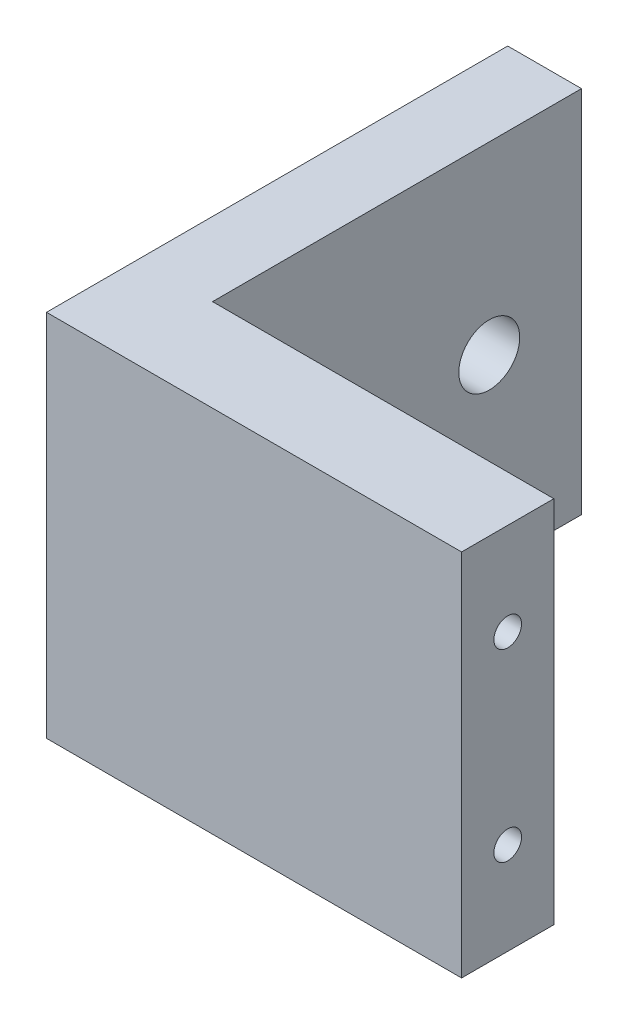
ISO-10303-21;
HEADER;
FILE_DESCRIPTION(('STEP AP214'),'2;1');
FILE_NAME('part.step','',(''),(''),'','','');
FILE_SCHEMA(('AUTOMOTIVE_DESIGN { 1 0 10303 214 1 1 1 1 }'));
ENDSEC;
DATA;
#1=APPLICATION_CONTEXT('core data for automotive mechanical design processes');
#2=APPLICATION_PROTOCOL_DEFINITION('international standard','automotive_design',2000,#1);
#3=PRODUCT_CONTEXT('',#1,'mechanical');
#4=PRODUCT('Part','Part','',(#3));
#5=PRODUCT_RELATED_PRODUCT_CATEGORY('part','',(#4));
#6=PRODUCT_DEFINITION_FORMATION('','',#4);
#7=PRODUCT_DEFINITION_CONTEXT('part definition',#1,'design');
#8=PRODUCT_DEFINITION('design','',#6,#7);
#9=PRODUCT_DEFINITION_SHAPE('','',#8);
#10=(LENGTH_UNIT() NAMED_UNIT(*) SI_UNIT(.MILLI.,.METRE.));
#11=(NAMED_UNIT(*) PLANE_ANGLE_UNIT() SI_UNIT($,.RADIAN.));
#12=(NAMED_UNIT(*) SI_UNIT($,.STERADIAN.) SOLID_ANGLE_UNIT());
#13=UNCERTAINTY_MEASURE_WITH_UNIT(LENGTH_MEASURE(1.E-05),#10,'distance_accuracy_value','');
#14=(GEOMETRIC_REPRESENTATION_CONTEXT(3) GLOBAL_UNCERTAINTY_ASSIGNED_CONTEXT((#13)) GLOBAL_UNIT_ASSIGNED_CONTEXT((#10,
#11,#12)) REPRESENTATION_CONTEXT('',''));
#15=CARTESIAN_POINT('',(0.,0.,0.));
#16=DIRECTION('',(0.,0.,1.));
#17=DIRECTION('',(1.,0.,0.));
#18=AXIS2_PLACEMENT_3D('',#15,#16,#17);
#19=CARTESIAN_POINT('',(0.002299999999991,20.,10.));
#20=DIRECTION('',(1.,0.,0.));
#21=DIRECTION('',(0.,0.,-1.));
#22=AXIS2_PLACEMENT_3D('',#19,#20,#21);
#23=CYLINDRICAL_SURFACE('',#22,3.3);
#24=CARTESIAN_POINT('',(0.002299999999991,20.,10.));
#25=DIRECTION('',(1.,0.,0.));
#26=DIRECTION('',(0.,0.,-1.));
#27=AXIS2_PLACEMENT_3D('',#24,#25,#26);
#28=CIRCLE('',#27,3.3);
#29=CARTESIAN_POINT('',(0.002299999999991,20.,6.7));
#30=VERTEX_POINT('',#29);
#31=EDGE_CURVE('E95',#30,#30,#28,.F.);
#32=ORIENTED_EDGE('',*,*,#31,.T.);
#33=EDGE_LOOP('',(#32));
#34=FACE_BOUND('',#33,.T.);
#35=CARTESIAN_POINT('',(8.0023,20.,10.));
#36=DIRECTION('',(1.,0.,0.));
#37=DIRECTION('',(0.,0.,-1.));
#38=AXIS2_PLACEMENT_3D('',#35,#36,#37);
#39=CIRCLE('',#38,3.3);
#40=CARTESIAN_POINT('',(8.0023,20.,6.7));
#41=VERTEX_POINT('',#40);
#42=EDGE_CURVE('E19',#41,#41,#39,.F.);
#43=ORIENTED_EDGE('',*,*,#42,.F.);
#44=EDGE_LOOP('',(#43));
#45=FACE_BOUND('',#44,.T.);
#46=ADVANCED_FACE('F16',(#34,#45),#23,.F.);
#47=CARTESIAN_POINT('',(0.002299999999991,20.,30.));
#48=DIRECTION('',(1.,0.,0.));
#49=DIRECTION('',(0.,0.,-1.));
#50=AXIS2_PLACEMENT_3D('',#47,#48,#49);
#51=CYLINDRICAL_SURFACE('',#50,3.3);
#52=CARTESIAN_POINT('',(0.002299999999991,20.,30.));
#53=DIRECTION('',(1.,0.,0.));
#54=DIRECTION('',(0.,0.,-1.));
#55=AXIS2_PLACEMENT_3D('',#52,#53,#54);
#56=CIRCLE('',#55,3.3);
#57=CARTESIAN_POINT('',(0.002299999999991,20.,26.7));
#58=VERTEX_POINT('',#57);
#59=EDGE_CURVE('E89',#58,#58,#56,.F.);
#60=ORIENTED_EDGE('',*,*,#59,.T.);
#61=EDGE_LOOP('',(#60));
#62=FACE_BOUND('',#61,.T.);
#63=CARTESIAN_POINT('',(8.0023,20.,30.));
#64=DIRECTION('',(1.,0.,0.));
#65=DIRECTION('',(0.,0.,-1.));
#66=AXIS2_PLACEMENT_3D('',#63,#64,#65);
#67=CIRCLE('',#66,3.3);
#68=CARTESIAN_POINT('',(8.0023,20.,26.7));
#69=VERTEX_POINT('',#68);
#70=EDGE_CURVE('E96',#69,#69,#67,.F.);
#71=ORIENTED_EDGE('',*,*,#70,.F.);
#72=EDGE_LOOP('',(#71));
#73=FACE_BOUND('',#72,.T.);
#74=ADVANCED_FACE('F121',(#62,#73),#51,.F.);
#75=CARTESIAN_POINT('',(37.0023,30.,45.));
#76=DIRECTION('',(-1.,0.,0.));
#77=DIRECTION('',(0.,0.,1.));
#78=AXIS2_PLACEMENT_3D('',#75,#76,#77);
#79=PLANE('',#78);
#80=CARTESIAN_POINT('',(37.0023,30.,45.));
#81=DIRECTION('',(-1.,0.,0.));
#82=DIRECTION('',(0.,0.,1.));
#83=AXIS2_PLACEMENT_3D('',#80,#81,#82);
#84=CIRCLE('',#83,1.5);
#85=CARTESIAN_POINT('',(37.0023,30.,46.5));
#86=VERTEX_POINT('',#85);
#87=EDGE_CURVE('E115',#86,#86,#84,.F.);
#88=ORIENTED_EDGE('',*,*,#87,.T.);
#89=EDGE_LOOP('',(#88));
#90=FACE_BOUND('',#89,.T.);
#91=ADVANCED_FACE('F197',(#90),#79,.F.);
#92=CARTESIAN_POINT('',(37.0023,10.,45.));
#93=DIRECTION('',(-1.,0.,0.));
#94=DIRECTION('',(0.,0.,1.));
#95=AXIS2_PLACEMENT_3D('',#92,#93,#94);
#96=PLANE('',#95);
#97=CARTESIAN_POINT('',(37.0023,10.,45.));
#98=DIRECTION('',(-1.,0.,0.));
#99=DIRECTION('',(0.,0.,1.));
#100=AXIS2_PLACEMENT_3D('',#97,#98,#99);
#101=CIRCLE('',#100,1.5);
#102=CARTESIAN_POINT('',(37.0023,10.,46.5));
#103=VERTEX_POINT('',#102);
#104=EDGE_CURVE('E111',#103,#103,#101,.F.);
#105=ORIENTED_EDGE('',*,*,#104,.T.);
#106=EDGE_LOOP('',(#105));
#107=FACE_BOUND('',#106,.T.);
#108=ADVANCED_FACE('F194',(#107),#96,.F.);
#109=CARTESIAN_POINT('',(0.002299999999991,0.,0.));
#110=DIRECTION('',(0.,0.,1.));
#111=DIRECTION('',(1.,0.,0.));
#112=AXIS2_PLACEMENT_3D('',#109,#110,#111);
#113=PLANE('',#112);
#114=DIRECTION('',(0.,1.,0.));
#115=VECTOR('',#114,1.);
#116=CARTESIAN_POINT('',(8.0023,0.,0.));
#117=LINE('',#116,#115);
#118=CARTESIAN_POINT('',(8.0023,0.,0.));
#119=VERTEX_POINT('',#118);
#120=CARTESIAN_POINT('',(8.0023,40.,0.));
#121=VERTEX_POINT('',#120);
#122=EDGE_CURVE('E66',#119,#121,#117,.T.);
#123=ORIENTED_EDGE('',*,*,#122,.F.);
#124=DIRECTION('',(1.,0.,0.));
#125=VECTOR('',#124,1.);
#126=CARTESIAN_POINT('',(0.002299999999991,0.,0.));
#127=LINE('',#126,#125);
#128=CARTESIAN_POINT('',(0.002299999999991,0.,0.));
#129=VERTEX_POINT('',#128);
#130=EDGE_CURVE('E75',#119,#129,#127,.F.);
#131=ORIENTED_EDGE('',*,*,#130,.T.);
#132=DIRECTION('',(0.,1.,0.));
#133=VECTOR('',#132,1.);
#134=CARTESIAN_POINT('',(0.002299999999991,0.,0.));
#135=LINE('',#134,#133);
#136=CARTESIAN_POINT('',(0.002299999999991,40.,0.));
#137=VERTEX_POINT('',#136);
#138=EDGE_CURVE('E86',#129,#137,#135,.T.);
#139=ORIENTED_EDGE('',*,*,#138,.T.);
#140=DIRECTION('',(1.,0.,0.));
#141=VECTOR('',#140,1.);
#142=CARTESIAN_POINT('',(0.002299999999991,40.,0.));
#143=LINE('',#142,#141);
#144=EDGE_CURVE('E114',#121,#137,#143,.F.);
#145=ORIENTED_EDGE('',*,*,#144,.F.);
#146=EDGE_LOOP('',(#123,#131,#139,#145));
#147=FACE_BOUND('',#146,.T.);
#148=ADVANCED_FACE('F85',(#147),#113,.F.);
#149=CARTESIAN_POINT('',(8.0023,0.,0.));
#150=DIRECTION('',(1.,0.,0.));
#151=DIRECTION('',(0.,0.,-1.));
#152=AXIS2_PLACEMENT_3D('',#149,#150,#151);
#153=PLANE('',#152);
#154=ORIENTED_EDGE('',*,*,#70,.T.);
#155=EDGE_LOOP('',(#154));
#156=FACE_BOUND('',#155,.T.);
#157=ORIENTED_EDGE('',*,*,#42,.T.);
#158=EDGE_LOOP('',(#157));
#159=FACE_BOUND('',#158,.T.);
#160=DIRECTION('',(0.,0.,1.));
#161=VECTOR('',#160,1.);
#162=CARTESIAN_POINT('',(8.0023,40.,0.));
#163=LINE('',#162,#161);
#164=CARTESIAN_POINT('',(8.0023,40.,40.));
#165=VERTEX_POINT('',#164);
#166=EDGE_CURVE('E141',#165,#121,#163,.F.);
#167=ORIENTED_EDGE('',*,*,#166,.F.);
#168=DIRECTION('',(0.,1.,0.));
#169=VECTOR('',#168,1.);
#170=CARTESIAN_POINT('',(8.0023,0.,40.));
#171=LINE('',#170,#169);
#172=CARTESIAN_POINT('',(8.0023,0.,40.));
#173=VERTEX_POINT('',#172);
#174=EDGE_CURVE('E82',#165,#173,#171,.F.);
#175=ORIENTED_EDGE('',*,*,#174,.T.);
#176=DIRECTION('',(0.,0.,1.));
#177=VECTOR('',#176,1.);
#178=CARTESIAN_POINT('',(8.0023,0.,0.));
#179=LINE('',#178,#177);
#180=EDGE_CURVE('E88',#173,#119,#179,.F.);
#181=ORIENTED_EDGE('',*,*,#180,.T.);
#182=ORIENTED_EDGE('',*,*,#122,.T.);
#183=EDGE_LOOP('',(#167,#175,#181,#182));
#184=FACE_BOUND('',#183,.T.);
#185=ADVANCED_FACE('F134',(#156,#159,#184),#153,.T.);
#186=CARTESIAN_POINT('',(45.0023,30.,45.));
#187=DIRECTION('',(-1.,0.,0.));
#188=DIRECTION('',(0.,0.,1.));
#189=AXIS2_PLACEMENT_3D('',#186,#187,#188);
#190=CYLINDRICAL_SURFACE('',#189,1.5);
#191=CARTESIAN_POINT('',(45.0023,30.,45.));
#192=DIRECTION('',(-1.,0.,0.));
#193=DIRECTION('',(0.,0.,1.));
#194=AXIS2_PLACEMENT_3D('',#191,#192,#193);
#195=CIRCLE('',#194,1.5);
#196=CARTESIAN_POINT('',(45.0023,30.,46.5));
#197=VERTEX_POINT('',#196);
#198=EDGE_CURVE('E107',#197,#197,#195,.T.);
#199=ORIENTED_EDGE('',*,*,#198,.F.);
#200=EDGE_LOOP('',(#199));
#201=FACE_BOUND('',#200,.T.);
#202=ORIENTED_EDGE('',*,*,#87,.F.);
#203=EDGE_LOOP('',(#202));
#204=FACE_BOUND('',#203,.T.);
#205=ADVANCED_FACE('F137',(#201,#204),#190,.F.);
#206=CARTESIAN_POINT('',(45.0023,10.,45.));
#207=DIRECTION('',(-1.,0.,0.));
#208=DIRECTION('',(0.,0.,1.));
#209=AXIS2_PLACEMENT_3D('',#206,#207,#208);
#210=CYLINDRICAL_SURFACE('',#209,1.5);
#211=CARTESIAN_POINT('',(45.0023,10.,45.));
#212=DIRECTION('',(-1.,0.,0.));
#213=DIRECTION('',(0.,0.,1.));
#214=AXIS2_PLACEMENT_3D('',#211,#212,#213);
#215=CIRCLE('',#214,1.5);
#216=CARTESIAN_POINT('',(45.0023,10.,46.5));
#217=VERTEX_POINT('',#216);
#218=EDGE_CURVE('E104',#217,#217,#215,.T.);
#219=ORIENTED_EDGE('',*,*,#218,.F.);
#220=EDGE_LOOP('',(#219));
#221=FACE_BOUND('',#220,.T.);
#222=ORIENTED_EDGE('',*,*,#104,.F.);
#223=EDGE_LOOP('',(#222));
#224=FACE_BOUND('',#223,.T.);
#225=ADVANCED_FACE('F185',(#221,#224),#210,.F.);
#226=CARTESIAN_POINT('',(0.002299999999991,0.,40.));
#227=DIRECTION('',(0.,0.,1.));
#228=DIRECTION('',(1.,0.,0.));
#229=AXIS2_PLACEMENT_3D('',#226,#227,#228);
#230=PLANE('',#229);
#231=DIRECTION('',(0.,1.,0.));
#232=VECTOR('',#231,1.);
#233=CARTESIAN_POINT('',(45.0023,0.,40.));
#234=LINE('',#233,#232);
#235=CARTESIAN_POINT('',(45.0023,0.,40.));
#236=VERTEX_POINT('',#235);
#237=CARTESIAN_POINT('',(45.0023,40.,40.));
#238=VERTEX_POINT('',#237);
#239=EDGE_CURVE('E110',#236,#238,#234,.T.);
#240=ORIENTED_EDGE('',*,*,#239,.F.);
#241=DIRECTION('',(1.,0.,0.));
#242=VECTOR('',#241,1.);
#243=CARTESIAN_POINT('',(0.002299999999991,0.,40.));
#244=LINE('',#243,#242);
#245=EDGE_CURVE('E81',#236,#173,#244,.F.);
#246=ORIENTED_EDGE('',*,*,#245,.T.);
#247=ORIENTED_EDGE('',*,*,#174,.F.);
#248=DIRECTION('',(1.,0.,0.));
#249=VECTOR('',#248,1.);
#250=CARTESIAN_POINT('',(0.002299999999991,40.,40.));
#251=LINE('',#250,#249);
#252=EDGE_CURVE('E150',#238,#165,#251,.F.);
#253=ORIENTED_EDGE('',*,*,#252,.F.);
#254=EDGE_LOOP('',(#240,#246,#247,#253));
#255=FACE_BOUND('',#254,.T.);
#256=ADVANCED_FACE('F125',(#255),#230,.F.);
#257=CARTESIAN_POINT('',(0.002299999999991,0.,40.));
#258=DIRECTION('',(1.,0.,0.));
#259=DIRECTION('',(0.,0.,-1.));
#260=AXIS2_PLACEMENT_3D('',#257,#258,#259);
#261=PLANE('',#260);
#262=DIRECTION('',(0.,0.,1.));
#263=VECTOR('',#262,1.);
#264=CARTESIAN_POINT('',(0.002299999999991,40.,40.));
#265=LINE('',#264,#263);
#266=CARTESIAN_POINT('',(0.002299999999991,40.,50.));
#267=VERTEX_POINT('',#266);
#268=EDGE_CURVE('E94',#137,#267,#265,.T.);
#269=ORIENTED_EDGE('',*,*,#268,.F.);
#270=ORIENTED_EDGE('',*,*,#138,.F.);
#271=DIRECTION('',(0.,0.,1.));
#272=VECTOR('',#271,1.);
#273=CARTESIAN_POINT('',(0.002299999999991,0.,40.));
#274=LINE('',#273,#272);
#275=CARTESIAN_POINT('',(0.002299999999991,0.,50.));
#276=VERTEX_POINT('',#275);
#277=EDGE_CURVE('E72',#129,#276,#274,.T.);
#278=ORIENTED_EDGE('',*,*,#277,.T.);
#279=DIRECTION('',(0.,1.,0.));
#280=VECTOR('',#279,1.);
#281=CARTESIAN_POINT('',(0.002299999999991,0.,50.));
#282=LINE('',#281,#280);
#283=EDGE_CURVE('E153',#267,#276,#282,.F.);
#284=ORIENTED_EDGE('',*,*,#283,.F.);
#285=EDGE_LOOP('',(#269,#270,#278,#284));
#286=FACE_BOUND('',#285,.T.);
#287=ORIENTED_EDGE('',*,*,#59,.F.);
#288=EDGE_LOOP('',(#287));
#289=FACE_BOUND('',#288,.T.);
#290=ORIENTED_EDGE('',*,*,#31,.F.);
#291=EDGE_LOOP('',(#290));
#292=FACE_BOUND('',#291,.T.);
#293=ADVANCED_FACE('F91',(#286,#289,#292),#261,.F.);
#294=CARTESIAN_POINT('',(0.002299999999991,0.,40.));
#295=DIRECTION('',(0.,1.,0.));
#296=DIRECTION('',(0.,0.,1.));
#297=AXIS2_PLACEMENT_3D('',#294,#295,#296);
#298=PLANE('',#297);
#299=DIRECTION('',(0.,0.,-1.));
#300=VECTOR('',#299,1.);
#301=CARTESIAN_POINT('',(45.0023,0.,40.));
#302=LINE('',#301,#300);
#303=CARTESIAN_POINT('',(45.0023,0.,50.));
#304=VERTEX_POINT('',#303);
#305=EDGE_CURVE('E161',#304,#236,#302,.T.);
#306=ORIENTED_EDGE('',*,*,#305,.F.);
#307=DIRECTION('',(1.,0.,0.));
#308=VECTOR('',#307,1.);
#309=CARTESIAN_POINT('',(0.002299999999991,0.,50.));
#310=LINE('',#309,#308);
#311=EDGE_CURVE('E77',#276,#304,#310,.T.);
#312=ORIENTED_EDGE('',*,*,#311,.F.);
#313=ORIENTED_EDGE('',*,*,#277,.F.);
#314=ORIENTED_EDGE('',*,*,#130,.F.);
#315=ORIENTED_EDGE('',*,*,#180,.F.);
#316=ORIENTED_EDGE('',*,*,#245,.F.);
#317=EDGE_LOOP('',(#306,#312,#313,#314,#315,#316));
#318=FACE_BOUND('',#317,.T.);
#319=ADVANCED_FACE('F73',(#318),#298,.F.);
#320=CARTESIAN_POINT('',(45.0023,0.,40.));
#321=DIRECTION('',(1.,0.,0.));
#322=DIRECTION('',(0.,0.,-1.));
#323=AXIS2_PLACEMENT_3D('',#320,#321,#322);
#324=PLANE('',#323);
#325=ORIENTED_EDGE('',*,*,#218,.T.);
#326=EDGE_LOOP('',(#325));
#327=FACE_BOUND('',#326,.T.);
#328=ORIENTED_EDGE('',*,*,#198,.T.);
#329=EDGE_LOOP('',(#328));
#330=FACE_BOUND('',#329,.T.);
#331=DIRECTION('',(0.,0.,1.));
#332=VECTOR('',#331,1.);
#333=CARTESIAN_POINT('',(45.0023,40.,40.));
#334=LINE('',#333,#332);
#335=CARTESIAN_POINT('',(45.0023,40.,50.));
#336=VERTEX_POINT('',#335);
#337=EDGE_CURVE('E34',#336,#238,#334,.F.);
#338=ORIENTED_EDGE('',*,*,#337,.F.);
#339=DIRECTION('',(0.,1.,0.));
#340=VECTOR('',#339,1.);
#341=CARTESIAN_POINT('',(45.0023,0.,50.));
#342=LINE('',#341,#340);
#343=EDGE_CURVE('E25',#304,#336,#342,.T.);
#344=ORIENTED_EDGE('',*,*,#343,.F.);
#345=ORIENTED_EDGE('',*,*,#305,.T.);
#346=ORIENTED_EDGE('',*,*,#239,.T.);
#347=EDGE_LOOP('',(#338,#344,#345,#346));
#348=FACE_BOUND('',#347,.T.);
#349=ADVANCED_FACE('F165',(#327,#330,#348),#324,.T.);
#350=CARTESIAN_POINT('',(0.002299999999991,40.,40.));
#351=DIRECTION('',(0.,1.,0.));
#352=DIRECTION('',(0.,0.,1.));
#353=AXIS2_PLACEMENT_3D('',#350,#351,#352);
#354=PLANE('',#353);
#355=ORIENTED_EDGE('',*,*,#337,.T.);
#356=ORIENTED_EDGE('',*,*,#252,.T.);
#357=ORIENTED_EDGE('',*,*,#166,.T.);
#358=ORIENTED_EDGE('',*,*,#144,.T.);
#359=ORIENTED_EDGE('',*,*,#268,.T.);
#360=DIRECTION('',(1.,0.,0.));
#361=VECTOR('',#360,1.);
#362=CARTESIAN_POINT('',(0.002299999999991,40.,50.));
#363=LINE('',#362,#361);
#364=EDGE_CURVE('E11',#336,#267,#363,.F.);
#365=ORIENTED_EDGE('',*,*,#364,.F.);
#366=EDGE_LOOP('',(#355,#356,#357,#358,#359,#365));
#367=FACE_BOUND('',#366,.T.);
#368=ADVANCED_FACE('F152',(#367),#354,.T.);
#369=CARTESIAN_POINT('',(0.002299999999991,0.,50.));
#370=DIRECTION('',(0.,0.,1.));
#371=DIRECTION('',(1.,0.,0.));
#372=AXIS2_PLACEMENT_3D('',#369,#370,#371);
#373=PLANE('',#372);
#374=ORIENTED_EDGE('',*,*,#343,.T.);
#375=ORIENTED_EDGE('',*,*,#364,.T.);
#376=ORIENTED_EDGE('',*,*,#283,.T.);
#377=ORIENTED_EDGE('',*,*,#311,.T.);
#378=EDGE_LOOP('',(#374,#375,#376,#377));
#379=FACE_BOUND('',#378,.T.);
#380=ADVANCED_FACE('F169',(#379),#373,.T.);
#381=CLOSED_SHELL('',(#46,#74,#91,#108,#148,#185,#205,#225,#256,#293,#319,#349,#368,#380));
#382=MANIFOLD_SOLID_BREP('B1',#381);
#383=ADVANCED_BREP_SHAPE_REPRESENTATION('',(#18,#382),#14);
#384=SHAPE_DEFINITION_REPRESENTATION(#9,#383);
ENDSEC;
END-ISO-10303-21;
